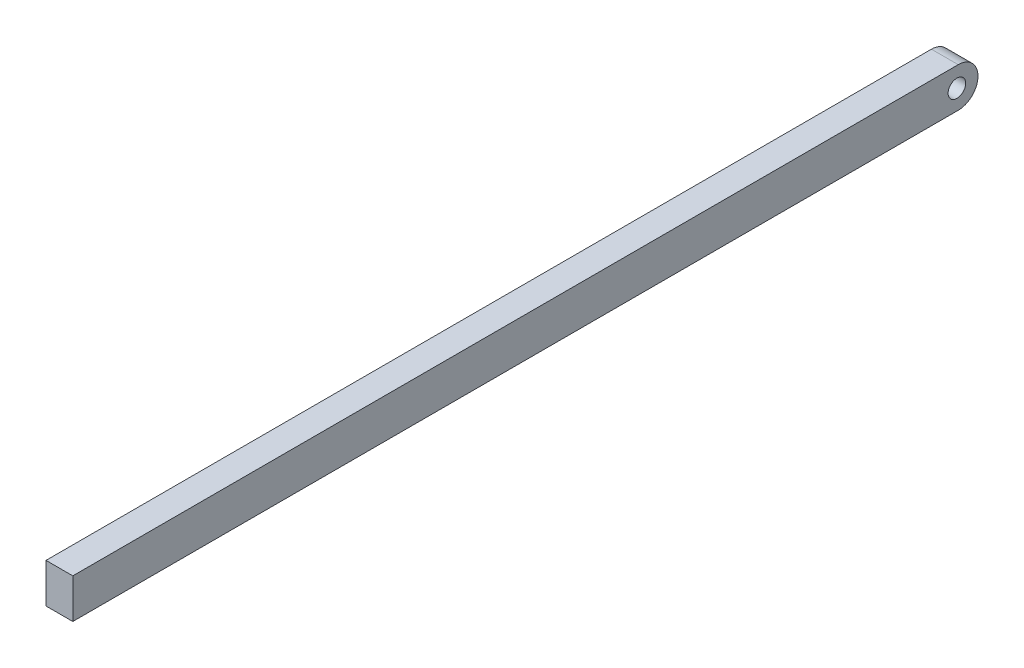
ISO-10303-21;
HEADER;
FILE_DESCRIPTION(('STEP AP214'),'2;1');
FILE_NAME('part.step','',(''),(''),'','','');
FILE_SCHEMA(('AUTOMOTIVE_DESIGN { 1 0 10303 214 1 1 1 1 }'));
ENDSEC;
DATA;
#1=APPLICATION_CONTEXT('core data for automotive mechanical design processes');
#2=APPLICATION_PROTOCOL_DEFINITION('international standard','automotive_design',2000,#1);
#3=PRODUCT_CONTEXT('',#1,'mechanical');
#4=PRODUCT('Part','Part','',(#3));
#5=PRODUCT_RELATED_PRODUCT_CATEGORY('part','',(#4));
#6=PRODUCT_DEFINITION_FORMATION('','',#4);
#7=PRODUCT_DEFINITION_CONTEXT('part definition',#1,'design');
#8=PRODUCT_DEFINITION('design','',#6,#7);
#9=PRODUCT_DEFINITION_SHAPE('','',#8);
#10=(LENGTH_UNIT() NAMED_UNIT(*) SI_UNIT(.MILLI.,.METRE.));
#11=(NAMED_UNIT(*) PLANE_ANGLE_UNIT() SI_UNIT($,.RADIAN.));
#12=(NAMED_UNIT(*) SI_UNIT($,.STERADIAN.) SOLID_ANGLE_UNIT());
#13=UNCERTAINTY_MEASURE_WITH_UNIT(LENGTH_MEASURE(1.E-05),#10,'distance_accuracy_value','');
#14=(GEOMETRIC_REPRESENTATION_CONTEXT(3) GLOBAL_UNCERTAINTY_ASSIGNED_CONTEXT((#13)) GLOBAL_UNIT_ASSIGNED_CONTEXT((#10,
#11,#12)) REPRESENTATION_CONTEXT('',''));
#15=CARTESIAN_POINT('',(0.,0.,0.));
#16=DIRECTION('',(0.,0.,1.));
#17=DIRECTION('',(1.,0.,0.));
#18=AXIS2_PLACEMENT_3D('',#15,#16,#17);
#19=CARTESIAN_POINT('',(3.05,-4.5,9.29));
#20=DIRECTION('',(-1.,0.,0.));
#21=DIRECTION('',(0.,0.,1.));
#22=AXIS2_PLACEMENT_3D('',#19,#20,#21);
#23=PLANE('',#22);
#24=CARTESIAN_POINT('',(3.05,0.,4.8));
#25=DIRECTION('',(1.,0.,0.));
#26=DIRECTION('',(0.,0.,-1.));
#27=AXIS2_PLACEMENT_3D('',#24,#25,#26);
#28=CIRCLE('',#27,2.);
#29=CARTESIAN_POINT('',(3.05,0.,2.8));
#30=VERTEX_POINT('',#29);
#31=EDGE_CURVE('E144',#30,#30,#28,.T.);
#32=ORIENTED_EDGE('',*,*,#31,.F.);
#33=EDGE_LOOP('',(#32));
#34=FACE_BOUND('',#33,.T.);
#35=DIRECTION('',(0.,0.,-1.));
#36=VECTOR('',#35,1.);
#37=CARTESIAN_POINT('',(3.05,-4.5,9.29));
#38=LINE('',#37,#36);
#39=CARTESIAN_POINT('',(3.05,-4.5,205.99));
#40=VERTEX_POINT('',#39);
#41=CARTESIAN_POINT('',(3.05,-4.5,4.5));
#42=VERTEX_POINT('',#41);
#43=EDGE_CURVE('E157',#40,#42,#38,.T.);
#44=ORIENTED_EDGE('',*,*,#43,.T.);
#45=CARTESIAN_POINT('',(3.05,0.,4.5));
#46=DIRECTION('',(1.,0.,0.));
#47=DIRECTION('',(0.,0.,-1.));
#48=AXIS2_PLACEMENT_3D('',#45,#46,#47);
#49=CIRCLE('',#48,4.5);
#50=CARTESIAN_POINT('',(3.05,4.5,4.5));
#51=VERTEX_POINT('',#50);
#52=EDGE_CURVE('E125',#42,#51,#49,.T.);
#53=ORIENTED_EDGE('',*,*,#52,.T.);
#54=DIRECTION('',(0.,0.,-1.));
#55=VECTOR('',#54,1.);
#56=CARTESIAN_POINT('',(3.05,4.5,9.29));
#57=LINE('',#56,#55);
#58=CARTESIAN_POINT('',(3.05,4.5,205.99));
#59=VERTEX_POINT('',#58);
#60=EDGE_CURVE('E12',#59,#51,#57,.T.);
#61=ORIENTED_EDGE('',*,*,#60,.F.);
#62=DIRECTION('',(0.,1.,0.));
#63=VECTOR('',#62,1.);
#64=CARTESIAN_POINT('',(3.05,-4.5,205.99));
#65=LINE('',#64,#63);
#66=EDGE_CURVE('E124',#40,#59,#65,.T.);
#67=ORIENTED_EDGE('',*,*,#66,.F.);
#68=EDGE_LOOP('',(#44,#53,#61,#67));
#69=FACE_BOUND('',#68,.T.);
#70=ADVANCED_FACE('F85',(#34,#69),#23,.F.);
#71=CARTESIAN_POINT('',(-3.05,-4.5,9.29));
#72=DIRECTION('',(1.,0.,0.));
#73=DIRECTION('',(0.,0.,-1.));
#74=AXIS2_PLACEMENT_3D('',#71,#72,#73);
#75=PLANE('',#74);
#76=CARTESIAN_POINT('',(-3.05,0.,4.8));
#77=DIRECTION('',(1.,0.,0.));
#78=DIRECTION('',(0.,0.,-1.));
#79=AXIS2_PLACEMENT_3D('',#76,#77,#78);
#80=CIRCLE('',#79,2.);
#81=CARTESIAN_POINT('',(-3.05,0.,2.8));
#82=VERTEX_POINT('',#81);
#83=EDGE_CURVE('E145',#82,#82,#80,.T.);
#84=ORIENTED_EDGE('',*,*,#83,.T.);
#85=EDGE_LOOP('',(#84));
#86=FACE_BOUND('',#85,.T.);
#87=CARTESIAN_POINT('',(-3.05,0.,4.5));
#88=DIRECTION('',(1.,0.,0.));
#89=DIRECTION('',(0.,0.,-1.));
#90=AXIS2_PLACEMENT_3D('',#87,#88,#89);
#91=CIRCLE('',#90,4.5);
#92=CARTESIAN_POINT('',(-3.05,-4.5,4.5));
#93=VERTEX_POINT('',#92);
#94=CARTESIAN_POINT('',(-3.05,4.5,4.5));
#95=VERTEX_POINT('',#94);
#96=EDGE_CURVE('E99',#93,#95,#91,.T.);
#97=ORIENTED_EDGE('',*,*,#96,.F.);
#98=DIRECTION('',(0.,0.,-1.));
#99=VECTOR('',#98,1.);
#100=CARTESIAN_POINT('',(-3.05,-4.5,9.29));
#101=LINE('',#100,#99);
#102=CARTESIAN_POINT('',(-3.05,-4.5,205.99));
#103=VERTEX_POINT('',#102);
#104=EDGE_CURVE('E159',#103,#93,#101,.T.);
#105=ORIENTED_EDGE('',*,*,#104,.F.);
#106=DIRECTION('',(0.,-1.,0.));
#107=VECTOR('',#106,1.);
#108=CARTESIAN_POINT('',(-3.05,-4.5,205.99));
#109=LINE('',#108,#107);
#110=CARTESIAN_POINT('',(-3.05,4.5,205.99));
#111=VERTEX_POINT('',#110);
#112=EDGE_CURVE('E134',#111,#103,#109,.T.);
#113=ORIENTED_EDGE('',*,*,#112,.F.);
#114=DIRECTION('',(0.,0.,-1.));
#115=VECTOR('',#114,1.);
#116=CARTESIAN_POINT('',(-3.05,4.5,9.29));
#117=LINE('',#116,#115);
#118=EDGE_CURVE('E93',#111,#95,#117,.T.);
#119=ORIENTED_EDGE('',*,*,#118,.T.);
#120=EDGE_LOOP('',(#97,#105,#113,#119));
#121=FACE_BOUND('',#120,.T.);
#122=ADVANCED_FACE('F162',(#86,#121),#75,.F.);
#123=CARTESIAN_POINT('',(-3.05,4.5,9.29));
#124=DIRECTION('',(0.,-1.,0.));
#125=DIRECTION('',(0.,0.,-1.));
#126=AXIS2_PLACEMENT_3D('',#123,#124,#125);
#127=PLANE('',#126);
#128=DIRECTION('',(1.,0.,0.));
#129=VECTOR('',#128,1.);
#130=CARTESIAN_POINT('',(-3.05,4.5,4.5));
#131=LINE('',#130,#129);
#132=EDGE_CURVE('E154',#95,#51,#131,.T.);
#133=ORIENTED_EDGE('',*,*,#132,.F.);
#134=ORIENTED_EDGE('',*,*,#118,.F.);
#135=DIRECTION('',(-1.,0.,0.));
#136=VECTOR('',#135,1.);
#137=CARTESIAN_POINT('',(-3.05,4.5,205.99));
#138=LINE('',#137,#136);
#139=EDGE_CURVE('E128',#59,#111,#138,.T.);
#140=ORIENTED_EDGE('',*,*,#139,.F.);
#141=ORIENTED_EDGE('',*,*,#60,.T.);
#142=EDGE_LOOP('',(#133,#134,#140,#141));
#143=FACE_BOUND('',#142,.T.);
#144=ADVANCED_FACE('F129',(#143),#127,.F.);
#145=CARTESIAN_POINT('',(-3.05,-4.5,9.29));
#146=DIRECTION('',(0.,1.,0.));
#147=DIRECTION('',(0.,0.,1.));
#148=AXIS2_PLACEMENT_3D('',#145,#146,#147);
#149=PLANE('',#148);
#150=ORIENTED_EDGE('',*,*,#104,.T.);
#151=DIRECTION('',(1.,0.,0.));
#152=VECTOR('',#151,1.);
#153=CARTESIAN_POINT('',(-3.05,-4.5,4.5));
#154=LINE('',#153,#152);
#155=EDGE_CURVE('E148',#93,#42,#154,.T.);
#156=ORIENTED_EDGE('',*,*,#155,.T.);
#157=ORIENTED_EDGE('',*,*,#43,.F.);
#158=DIRECTION('',(1.,0.,0.));
#159=VECTOR('',#158,1.);
#160=CARTESIAN_POINT('',(-3.05,-4.5,205.99));
#161=LINE('',#160,#159);
#162=EDGE_CURVE('E139',#103,#40,#161,.T.);
#163=ORIENTED_EDGE('',*,*,#162,.F.);
#164=EDGE_LOOP('',(#150,#156,#157,#163));
#165=FACE_BOUND('',#164,.T.);
#166=ADVANCED_FACE('F164',(#165),#149,.F.);
#167=CARTESIAN_POINT('',(-3.05,0.,4.5));
#168=DIRECTION('',(1.,0.,0.));
#169=DIRECTION('',(0.,0.,-1.));
#170=AXIS2_PLACEMENT_3D('',#167,#168,#169);
#171=CYLINDRICAL_SURFACE('',#170,4.5);
#172=ORIENTED_EDGE('',*,*,#52,.F.);
#173=ORIENTED_EDGE('',*,*,#155,.F.);
#174=ORIENTED_EDGE('',*,*,#96,.T.);
#175=ORIENTED_EDGE('',*,*,#132,.T.);
#176=EDGE_LOOP('',(#172,#173,#174,#175));
#177=FACE_BOUND('',#176,.T.);
#178=ADVANCED_FACE('F165',(#177),#171,.T.);
#179=CARTESIAN_POINT('',(-3.05,0.,4.8));
#180=DIRECTION('',(1.,0.,0.));
#181=DIRECTION('',(0.,0.,-1.));
#182=AXIS2_PLACEMENT_3D('',#179,#180,#181);
#183=CYLINDRICAL_SURFACE('',#182,2.);
#184=ORIENTED_EDGE('',*,*,#83,.F.);
#185=EDGE_LOOP('',(#184));
#186=FACE_BOUND('',#185,.T.);
#187=ORIENTED_EDGE('',*,*,#31,.T.);
#188=EDGE_LOOP('',(#187));
#189=FACE_BOUND('',#188,.T.);
#190=ADVANCED_FACE('F167',(#186,#189),#183,.F.);
#191=CARTESIAN_POINT('',(0.,0.,205.99));
#192=DIRECTION('',(0.,0.,-1.));
#193=DIRECTION('',(-1.,0.,0.));
#194=AXIS2_PLACEMENT_3D('',#191,#192,#193);
#195=PLANE('',#194);
#196=ORIENTED_EDGE('',*,*,#66,.T.);
#197=ORIENTED_EDGE('',*,*,#139,.T.);
#198=ORIENTED_EDGE('',*,*,#112,.T.);
#199=ORIENTED_EDGE('',*,*,#162,.T.);
#200=EDGE_LOOP('',(#196,#197,#198,#199));
#201=FACE_BOUND('',#200,.T.);
#202=ADVANCED_FACE('F137',(#201),#195,.F.);
#203=CLOSED_SHELL('',(#70,#122,#144,#166,#178,#190,#202));
#204=MANIFOLD_SOLID_BREP('B2',#203);
#205=ADVANCED_BREP_SHAPE_REPRESENTATION('',(#18,#204),#14);
#206=SHAPE_DEFINITION_REPRESENTATION(#9,#205);
ENDSEC;
END-ISO-10303-21;
